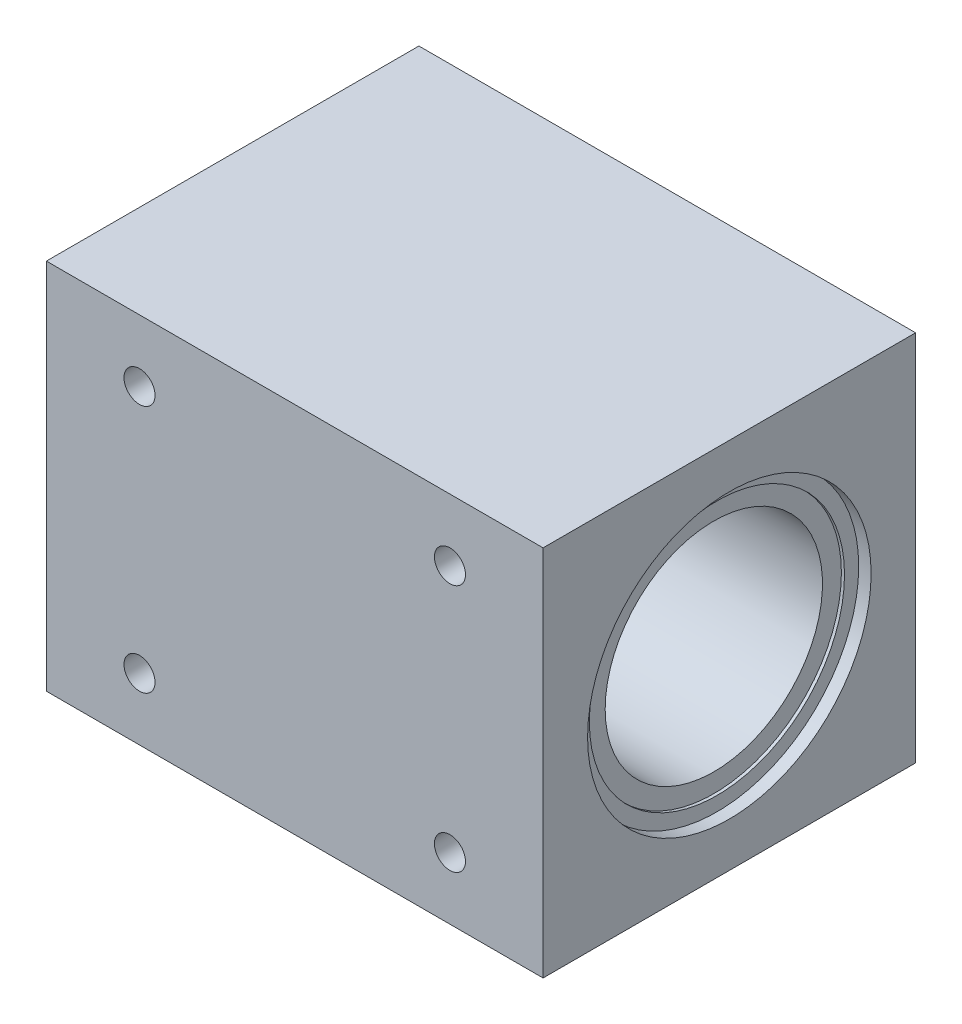
ISO-10303-21;
HEADER;
FILE_DESCRIPTION(('STEP AP214'),'2;1');
FILE_NAME('part.step','',(''),(''),'','','');
FILE_SCHEMA(('AUTOMOTIVE_DESIGN { 1 0 10303 214 1 1 1 1 }'));
ENDSEC;
DATA;
#1=APPLICATION_CONTEXT('core data for automotive mechanical design processes');
#2=APPLICATION_PROTOCOL_DEFINITION('international standard','automotive_design',2000,#1);
#3=PRODUCT_CONTEXT('',#1,'mechanical');
#4=PRODUCT('Part','Part','',(#3));
#5=PRODUCT_RELATED_PRODUCT_CATEGORY('part','',(#4));
#6=PRODUCT_DEFINITION_FORMATION('','',#4);
#7=PRODUCT_DEFINITION_CONTEXT('part definition',#1,'design');
#8=PRODUCT_DEFINITION('design','',#6,#7);
#9=PRODUCT_DEFINITION_SHAPE('','',#8);
#10=(LENGTH_UNIT() NAMED_UNIT(*) SI_UNIT(.MILLI.,.METRE.));
#11=(NAMED_UNIT(*) PLANE_ANGLE_UNIT() SI_UNIT($,.RADIAN.));
#12=(NAMED_UNIT(*) SI_UNIT($,.STERADIAN.) SOLID_ANGLE_UNIT());
#13=UNCERTAINTY_MEASURE_WITH_UNIT(LENGTH_MEASURE(1.E-05),#10,'distance_accuracy_value','');
#14=(GEOMETRIC_REPRESENTATION_CONTEXT(3) GLOBAL_UNCERTAINTY_ASSIGNED_CONTEXT((#13)) GLOBAL_UNIT_ASSIGNED_CONTEXT((#10,
#11,#12)) REPRESENTATION_CONTEXT('',''));
#15=CARTESIAN_POINT('',(0.,0.,0.));
#16=DIRECTION('',(0.,0.,1.));
#17=DIRECTION('',(1.,0.,0.));
#18=AXIS2_PLACEMENT_3D('',#15,#16,#17);
#19=CARTESIAN_POINT('',(80.,0.,0.));
#20=DIRECTION('',(-1.,0.,0.));
#21=DIRECTION('',(0.,0.,1.));
#22=AXIS2_PLACEMENT_3D('',#19,#20,#21);
#23=CYLINDRICAL_SURFACE('',#22,17.5);
#24=CARTESIAN_POINT('',(2.5,0.,0.));
#25=DIRECTION('',(-1.,0.,0.));
#26=DIRECTION('',(0.,0.,1.));
#27=AXIS2_PLACEMENT_3D('',#24,#25,#26);
#28=CIRCLE('',#27,17.5);
#29=CARTESIAN_POINT('',(2.5,0.,17.5));
#30=VERTEX_POINT('',#29);
#31=EDGE_CURVE('E161',#30,#30,#28,.T.);
#32=ORIENTED_EDGE('',*,*,#31,.T.);
#33=EDGE_LOOP('',(#32));
#34=FACE_BOUND('',#33,.T.);
#35=CARTESIAN_POINT('',(77.5,0.,0.));
#36=DIRECTION('',(-1.,0.,0.));
#37=DIRECTION('',(0.,0.,1.));
#38=AXIS2_PLACEMENT_3D('',#35,#36,#37);
#39=CIRCLE('',#38,17.5);
#40=CARTESIAN_POINT('',(77.5,0.,17.5));
#41=VERTEX_POINT('',#40);
#42=EDGE_CURVE('E146',#41,#41,#39,.T.);
#43=ORIENTED_EDGE('',*,*,#42,.F.);
#44=EDGE_LOOP('',(#43));
#45=FACE_BOUND('',#44,.T.);
#46=ADVANCED_FACE('F40',(#34,#45),#23,.F.);
#47=CARTESIAN_POINT('',(80.,0.,0.));
#48=DIRECTION('',(1.,0.,0.));
#49=DIRECTION('',(0.,0.,-1.));
#50=AXIS2_PLACEMENT_3D('',#47,#48,#49);
#51=PLANE('',#50);
#52=DIRECTION('',(0.,-1.,0.));
#53=VECTOR('',#52,1.);
#54=CARTESIAN_POINT('',(80.,30.,30.));
#55=LINE('',#54,#53);
#56=CARTESIAN_POINT('',(80.,30.,30.));
#57=VERTEX_POINT('',#56);
#58=CARTESIAN_POINT('',(80.,-30.,30.));
#59=VERTEX_POINT('',#58);
#60=EDGE_CURVE('E165',#57,#59,#55,.T.);
#61=ORIENTED_EDGE('',*,*,#60,.T.);
#62=DIRECTION('',(0.,0.,-1.));
#63=VECTOR('',#62,1.);
#64=CARTESIAN_POINT('',(80.,-30.,30.));
#65=LINE('',#64,#63);
#66=CARTESIAN_POINT('',(80.,-30.,-30.));
#67=VERTEX_POINT('',#66);
#68=EDGE_CURVE('E88',#59,#67,#65,.T.);
#69=ORIENTED_EDGE('',*,*,#68,.T.);
#70=DIRECTION('',(0.,1.,0.));
#71=VECTOR('',#70,1.);
#72=CARTESIAN_POINT('',(80.,-30.,-30.));
#73=LINE('',#72,#71);
#74=CARTESIAN_POINT('',(80.,30.,-30.));
#75=VERTEX_POINT('',#74);
#76=EDGE_CURVE('E168',#67,#75,#73,.T.);
#77=ORIENTED_EDGE('',*,*,#76,.T.);
#78=DIRECTION('',(0.,0.,1.));
#79=VECTOR('',#78,1.);
#80=CARTESIAN_POINT('',(80.,30.,-30.));
#81=LINE('',#80,#79);
#82=EDGE_CURVE('E57',#75,#57,#81,.T.);
#83=ORIENTED_EDGE('',*,*,#82,.T.);
#84=EDGE_LOOP('',(#61,#69,#77,#83));
#85=FACE_BOUND('',#84,.T.);
#86=CARTESIAN_POINT('',(80.,0.,0.));
#87=DIRECTION('',(-1.,0.,0.));
#88=DIRECTION('',(0.,0.,1.));
#89=AXIS2_PLACEMENT_3D('',#86,#87,#88);
#90=CIRCLE('',#89,22.8333333333333);
#91=CARTESIAN_POINT('',(80.,0.,22.8333333333333));
#92=VERTEX_POINT('',#91);
#93=EDGE_CURVE('E143',#92,#92,#90,.T.);
#94=ORIENTED_EDGE('',*,*,#93,.T.);
#95=EDGE_LOOP('',(#94));
#96=FACE_BOUND('',#95,.T.);
#97=ADVANCED_FACE('F204',(#85,#96),#51,.T.);
#98=CARTESIAN_POINT('',(0.,0.,0.));
#99=DIRECTION('',(1.,0.,0.));
#100=DIRECTION('',(0.,0.,-1.));
#101=AXIS2_PLACEMENT_3D('',#98,#99,#100);
#102=PLANE('',#101);
#103=DIRECTION('',(0.,-1.,0.));
#104=VECTOR('',#103,1.);
#105=CARTESIAN_POINT('',(0.,30.,30.));
#106=LINE('',#105,#104);
#107=CARTESIAN_POINT('',(0.,30.,30.));
#108=VERTEX_POINT('',#107);
#109=CARTESIAN_POINT('',(0.,-30.,30.));
#110=VERTEX_POINT('',#109);
#111=EDGE_CURVE('E164',#108,#110,#106,.T.);
#112=ORIENTED_EDGE('',*,*,#111,.F.);
#113=DIRECTION('',(0.,0.,1.));
#114=VECTOR('',#113,1.);
#115=CARTESIAN_POINT('',(0.,30.,-30.));
#116=LINE('',#115,#114);
#117=CARTESIAN_POINT('',(0.,30.,-30.));
#118=VERTEX_POINT('',#117);
#119=EDGE_CURVE('E81',#118,#108,#116,.T.);
#120=ORIENTED_EDGE('',*,*,#119,.F.);
#121=DIRECTION('',(0.,1.,0.));
#122=VECTOR('',#121,1.);
#123=CARTESIAN_POINT('',(0.,-30.,-30.));
#124=LINE('',#123,#122);
#125=CARTESIAN_POINT('',(0.,-30.,-30.));
#126=VERTEX_POINT('',#125);
#127=EDGE_CURVE('E75',#126,#118,#124,.T.);
#128=ORIENTED_EDGE('',*,*,#127,.F.);
#129=DIRECTION('',(0.,0.,-1.));
#130=VECTOR('',#129,1.);
#131=CARTESIAN_POINT('',(0.,-30.,30.));
#132=LINE('',#131,#130);
#133=EDGE_CURVE('E174',#110,#126,#132,.T.);
#134=ORIENTED_EDGE('',*,*,#133,.F.);
#135=EDGE_LOOP('',(#112,#120,#128,#134));
#136=FACE_BOUND('',#135,.T.);
#137=CARTESIAN_POINT('',(0.,0.,0.));
#138=DIRECTION('',(-1.,0.,0.));
#139=DIRECTION('',(0.,0.,1.));
#140=AXIS2_PLACEMENT_3D('',#137,#138,#139);
#141=CIRCLE('',#140,22.8333333333333);
#142=CARTESIAN_POINT('',(0.,0.,22.8333333333333));
#143=VERTEX_POINT('',#142);
#144=EDGE_CURVE('E149',#143,#143,#141,.T.);
#145=ORIENTED_EDGE('',*,*,#144,.F.);
#146=EDGE_LOOP('',(#145));
#147=FACE_BOUND('',#146,.T.);
#148=ADVANCED_FACE('F184',(#136,#147),#102,.F.);
#149=CARTESIAN_POINT('',(80.,30.,30.));
#150=DIRECTION('',(0.,0.,-1.));
#151=DIRECTION('',(-1.,0.,0.));
#152=AXIS2_PLACEMENT_3D('',#149,#150,#151);
#153=PLANE('',#152);
#154=CARTESIAN_POINT('',(15.,20.,30.));
#155=DIRECTION('',(0.,0.,1.));
#156=DIRECTION('',(1.,0.,0.));
#157=AXIS2_PLACEMENT_3D('',#154,#155,#156);
#158=CIRCLE('',#157,2.49999999999999);
#159=CARTESIAN_POINT('',(17.5,20.,30.));
#160=VERTEX_POINT('',#159);
#161=EDGE_CURVE('E112',#160,#160,#158,.T.);
#162=ORIENTED_EDGE('',*,*,#161,.F.);
#163=EDGE_LOOP('',(#162));
#164=FACE_BOUND('',#163,.T.);
#165=CARTESIAN_POINT('',(15.,-20.,30.));
#166=DIRECTION('',(0.,0.,1.));
#167=DIRECTION('',(1.,0.,0.));
#168=AXIS2_PLACEMENT_3D('',#165,#166,#167);
#169=CIRCLE('',#168,2.49999999999999);
#170=CARTESIAN_POINT('',(17.5,-20.,30.));
#171=VERTEX_POINT('',#170);
#172=EDGE_CURVE('E111',#171,#171,#169,.T.);
#173=ORIENTED_EDGE('',*,*,#172,.F.);
#174=EDGE_LOOP('',(#173));
#175=FACE_BOUND('',#174,.T.);
#176=CARTESIAN_POINT('',(65.,-20.,30.));
#177=DIRECTION('',(0.,0.,1.));
#178=DIRECTION('',(1.,0.,0.));
#179=AXIS2_PLACEMENT_3D('',#176,#177,#178);
#180=CIRCLE('',#179,2.49999999999999);
#181=CARTESIAN_POINT('',(67.5,-20.,30.));
#182=VERTEX_POINT('',#181);
#183=EDGE_CURVE('E122',#182,#182,#180,.T.);
#184=ORIENTED_EDGE('',*,*,#183,.F.);
#185=EDGE_LOOP('',(#184));
#186=FACE_BOUND('',#185,.T.);
#187=CARTESIAN_POINT('',(65.,20.,30.));
#188=DIRECTION('',(0.,0.,1.));
#189=DIRECTION('',(1.,0.,0.));
#190=AXIS2_PLACEMENT_3D('',#187,#188,#189);
#191=CIRCLE('',#190,2.49999999999999);
#192=CARTESIAN_POINT('',(67.5,20.,30.));
#193=VERTEX_POINT('',#192);
#194=EDGE_CURVE('E128',#193,#193,#191,.T.);
#195=ORIENTED_EDGE('',*,*,#194,.F.);
#196=EDGE_LOOP('',(#195));
#197=FACE_BOUND('',#196,.T.);
#198=ORIENTED_EDGE('',*,*,#111,.T.);
#199=DIRECTION('',(-1.,0.,0.));
#200=VECTOR('',#199,1.);
#201=CARTESIAN_POINT('',(80.,-30.,30.));
#202=LINE('',#201,#200);
#203=EDGE_CURVE('E11',#59,#110,#202,.T.);
#204=ORIENTED_EDGE('',*,*,#203,.F.);
#205=ORIENTED_EDGE('',*,*,#60,.F.);
#206=DIRECTION('',(-1.,0.,0.));
#207=VECTOR('',#206,1.);
#208=CARTESIAN_POINT('',(80.,30.,30.));
#209=LINE('',#208,#207);
#210=EDGE_CURVE('E171',#57,#108,#209,.T.);
#211=ORIENTED_EDGE('',*,*,#210,.T.);
#212=EDGE_LOOP('',(#198,#204,#205,#211));
#213=FACE_BOUND('',#212,.T.);
#214=ADVANCED_FACE('F42',(#164,#175,#186,#197,#213),#153,.F.);
#215=CARTESIAN_POINT('',(80.,-30.,30.));
#216=DIRECTION('',(0.,1.,0.));
#217=DIRECTION('',(0.,0.,1.));
#218=AXIS2_PLACEMENT_3D('',#215,#216,#217);
#219=PLANE('',#218);
#220=ORIENTED_EDGE('',*,*,#133,.T.);
#221=DIRECTION('',(-1.,0.,0.));
#222=VECTOR('',#221,1.);
#223=CARTESIAN_POINT('',(80.,-30.,-30.));
#224=LINE('',#223,#222);
#225=EDGE_CURVE('E49',#67,#126,#224,.T.);
#226=ORIENTED_EDGE('',*,*,#225,.F.);
#227=ORIENTED_EDGE('',*,*,#68,.F.);
#228=ORIENTED_EDGE('',*,*,#203,.T.);
#229=EDGE_LOOP('',(#220,#226,#227,#228));
#230=FACE_BOUND('',#229,.T.);
#231=ADVANCED_FACE('F200',(#230),#219,.F.);
#232=CARTESIAN_POINT('',(80.,-30.,-30.));
#233=DIRECTION('',(0.,0.,1.));
#234=DIRECTION('',(1.,0.,0.));
#235=AXIS2_PLACEMENT_3D('',#232,#233,#234);
#236=PLANE('',#235);
#237=ORIENTED_EDGE('',*,*,#127,.T.);
#238=DIRECTION('',(-1.,0.,0.));
#239=VECTOR('',#238,1.);
#240=CARTESIAN_POINT('',(80.,30.,-30.));
#241=LINE('',#240,#239);
#242=EDGE_CURVE('E179',#75,#118,#241,.T.);
#243=ORIENTED_EDGE('',*,*,#242,.F.);
#244=ORIENTED_EDGE('',*,*,#76,.F.);
#245=ORIENTED_EDGE('',*,*,#225,.T.);
#246=EDGE_LOOP('',(#237,#243,#244,#245));
#247=FACE_BOUND('',#246,.T.);
#248=ADVANCED_FACE('F181',(#247),#236,.F.);
#249=CARTESIAN_POINT('',(80.,30.,-30.));
#250=DIRECTION('',(0.,-1.,0.));
#251=DIRECTION('',(0.,0.,-1.));
#252=AXIS2_PLACEMENT_3D('',#249,#250,#251);
#253=PLANE('',#252);
#254=ORIENTED_EDGE('',*,*,#119,.T.);
#255=ORIENTED_EDGE('',*,*,#210,.F.);
#256=ORIENTED_EDGE('',*,*,#82,.F.);
#257=ORIENTED_EDGE('',*,*,#242,.T.);
#258=EDGE_LOOP('',(#254,#255,#256,#257));
#259=FACE_BOUND('',#258,.T.);
#260=ADVANCED_FACE('F189',(#259),#253,.F.);
#261=CARTESIAN_POINT('',(2.5,17.5,0.));
#262=DIRECTION('',(-1.,0.,0.));
#263=DIRECTION('',(0.,0.,1.));
#264=AXIS2_PLACEMENT_3D('',#261,#262,#263);
#265=PLANE('',#264);
#266=CARTESIAN_POINT('',(2.5,0.,0.));
#267=DIRECTION('',(-1.,0.,0.));
#268=DIRECTION('',(0.,0.,1.));
#269=AXIS2_PLACEMENT_3D('',#266,#267,#268);
#270=CIRCLE('',#269,20.547619047619);
#271=CARTESIAN_POINT('',(2.5,0.,20.547619047619));
#272=VERTEX_POINT('',#271);
#273=EDGE_CURVE('E158',#272,#272,#270,.T.);
#274=ORIENTED_EDGE('',*,*,#273,.T.);
#275=EDGE_LOOP('',(#274));
#276=FACE_BOUND('',#275,.T.);
#277=ORIENTED_EDGE('',*,*,#31,.F.);
#278=EDGE_LOOP('',(#277));
#279=FACE_BOUND('',#278,.T.);
#280=ADVANCED_FACE('F191',(#276,#279),#265,.T.);
#281=CARTESIAN_POINT('',(80.,0.,0.));
#282=DIRECTION('',(-1.,0.,0.));
#283=DIRECTION('',(0.,0.,1.));
#284=AXIS2_PLACEMENT_3D('',#281,#282,#283);
#285=CYLINDRICAL_SURFACE('',#284,20.547619047619);
#286=CARTESIAN_POINT('',(2.,0.,0.));
#287=DIRECTION('',(-1.,0.,0.));
#288=DIRECTION('',(0.,0.,1.));
#289=AXIS2_PLACEMENT_3D('',#286,#287,#288);
#290=CIRCLE('',#289,20.547619047619);
#291=CARTESIAN_POINT('',(2.,0.,20.547619047619));
#292=VERTEX_POINT('',#291);
#293=EDGE_CURVE('E155',#292,#292,#290,.T.);
#294=ORIENTED_EDGE('',*,*,#293,.T.);
#295=EDGE_LOOP('',(#294));
#296=FACE_BOUND('',#295,.T.);
#297=ORIENTED_EDGE('',*,*,#273,.F.);
#298=EDGE_LOOP('',(#297));
#299=FACE_BOUND('',#298,.T.);
#300=ADVANCED_FACE('F197',(#296,#299),#285,.F.);
#301=CARTESIAN_POINT('',(2.,20.547619047619,0.));
#302=DIRECTION('',(-1.,0.,0.));
#303=DIRECTION('',(0.,0.,1.));
#304=AXIS2_PLACEMENT_3D('',#301,#302,#303);
#305=PLANE('',#304);
#306=CARTESIAN_POINT('',(2.,0.,0.));
#307=DIRECTION('',(-1.,0.,0.));
#308=DIRECTION('',(0.,0.,1.));
#309=AXIS2_PLACEMENT_3D('',#306,#307,#308);
#310=CIRCLE('',#309,22.8333333333333);
#311=CARTESIAN_POINT('',(2.,0.,22.8333333333333));
#312=VERTEX_POINT('',#311);
#313=EDGE_CURVE('E152',#312,#312,#310,.T.);
#314=ORIENTED_EDGE('',*,*,#313,.T.);
#315=EDGE_LOOP('',(#314));
#316=FACE_BOUND('',#315,.T.);
#317=ORIENTED_EDGE('',*,*,#293,.F.);
#318=EDGE_LOOP('',(#317));
#319=FACE_BOUND('',#318,.T.);
#320=ADVANCED_FACE('F266',(#316,#319),#305,.T.);
#321=CARTESIAN_POINT('',(80.,0.,0.));
#322=DIRECTION('',(-1.,0.,0.));
#323=DIRECTION('',(0.,0.,1.));
#324=AXIS2_PLACEMENT_3D('',#321,#322,#323);
#325=CYLINDRICAL_SURFACE('',#324,22.8333333333333);
#326=ORIENTED_EDGE('',*,*,#144,.T.);
#327=EDGE_LOOP('',(#326));
#328=FACE_BOUND('',#327,.T.);
#329=ORIENTED_EDGE('',*,*,#313,.F.);
#330=EDGE_LOOP('',(#329));
#331=FACE_BOUND('',#330,.T.);
#332=ADVANCED_FACE('F262',(#328,#331),#325,.F.);
#333=CARTESIAN_POINT('',(77.5,20.547619047619,0.));
#334=DIRECTION('',(1.,0.,0.));
#335=DIRECTION('',(0.,0.,-1.));
#336=AXIS2_PLACEMENT_3D('',#333,#334,#335);
#337=PLANE('',#336);
#338=ORIENTED_EDGE('',*,*,#42,.T.);
#339=EDGE_LOOP('',(#338));
#340=FACE_BOUND('',#339,.T.);
#341=CARTESIAN_POINT('',(77.5,0.,0.));
#342=DIRECTION('',(-1.,0.,0.));
#343=DIRECTION('',(0.,0.,1.));
#344=AXIS2_PLACEMENT_3D('',#341,#342,#343);
#345=CIRCLE('',#344,20.547619047619);
#346=CARTESIAN_POINT('',(77.5,0.,20.547619047619));
#347=VERTEX_POINT('',#346);
#348=EDGE_CURVE('E134',#347,#347,#345,.T.);
#349=ORIENTED_EDGE('',*,*,#348,.F.);
#350=EDGE_LOOP('',(#349));
#351=FACE_BOUND('',#350,.T.);
#352=ADVANCED_FACE('F258',(#340,#351),#337,.T.);
#353=CARTESIAN_POINT('',(80.,0.,0.));
#354=DIRECTION('',(-1.,0.,0.));
#355=DIRECTION('',(0.,0.,1.));
#356=AXIS2_PLACEMENT_3D('',#353,#354,#355);
#357=CYLINDRICAL_SURFACE('',#356,22.8333333333333);
#358=CARTESIAN_POINT('',(78.,0.,0.));
#359=DIRECTION('',(-1.,0.,0.));
#360=DIRECTION('',(0.,0.,1.));
#361=AXIS2_PLACEMENT_3D('',#358,#359,#360);
#362=CIRCLE('',#361,22.8333333333333);
#363=CARTESIAN_POINT('',(78.,0.,22.8333333333333));
#364=VERTEX_POINT('',#363);
#365=EDGE_CURVE('E140',#364,#364,#362,.T.);
#366=ORIENTED_EDGE('',*,*,#365,.T.);
#367=EDGE_LOOP('',(#366));
#368=FACE_BOUND('',#367,.T.);
#369=ORIENTED_EDGE('',*,*,#93,.F.);
#370=EDGE_LOOP('',(#369));
#371=FACE_BOUND('',#370,.T.);
#372=ADVANCED_FACE('F254',(#368,#371),#357,.F.);
#373=CARTESIAN_POINT('',(78.,22.8333333333333,0.));
#374=DIRECTION('',(1.,0.,0.));
#375=DIRECTION('',(0.,0.,-1.));
#376=AXIS2_PLACEMENT_3D('',#373,#374,#375);
#377=PLANE('',#376);
#378=CARTESIAN_POINT('',(78.,0.,0.));
#379=DIRECTION('',(-1.,0.,0.));
#380=DIRECTION('',(0.,0.,1.));
#381=AXIS2_PLACEMENT_3D('',#378,#379,#380);
#382=CIRCLE('',#381,20.547619047619);
#383=CARTESIAN_POINT('',(78.,0.,20.547619047619));
#384=VERTEX_POINT('',#383);
#385=EDGE_CURVE('E137',#384,#384,#382,.T.);
#386=ORIENTED_EDGE('',*,*,#385,.T.);
#387=EDGE_LOOP('',(#386));
#388=FACE_BOUND('',#387,.T.);
#389=ORIENTED_EDGE('',*,*,#365,.F.);
#390=EDGE_LOOP('',(#389));
#391=FACE_BOUND('',#390,.T.);
#392=ADVANCED_FACE('F250',(#388,#391),#377,.T.);
#393=CARTESIAN_POINT('',(80.,0.,0.));
#394=DIRECTION('',(-1.,0.,0.));
#395=DIRECTION('',(0.,0.,1.));
#396=AXIS2_PLACEMENT_3D('',#393,#394,#395);
#397=CYLINDRICAL_SURFACE('',#396,20.547619047619);
#398=ORIENTED_EDGE('',*,*,#348,.T.);
#399=EDGE_LOOP('',(#398));
#400=FACE_BOUND('',#399,.T.);
#401=ORIENTED_EDGE('',*,*,#385,.F.);
#402=EDGE_LOOP('',(#401));
#403=FACE_BOUND('',#402,.T.);
#404=ADVANCED_FACE('F242',(#400,#403),#397,.F.);
#405=CARTESIAN_POINT('',(65.,20.,13.));
#406=DIRECTION('',(0.,0.,1.));
#407=DIRECTION('',(1.,0.,0.));
#408=AXIS2_PLACEMENT_3D('',#405,#406,#407);
#409=CONICAL_SURFACE('',#408,2.49999999999999,1.02974425867665);
#410=CARTESIAN_POINT('',(65.,20.,11.4978484524311));
#411=VERTEX_POINT('',#410);
#412=VERTEX_LOOP('',#411);
#413=FACE_BOUND('',#412,.T.);
#414=CARTESIAN_POINT('',(65.,20.,13.));
#415=DIRECTION('',(0.,0.,1.));
#416=DIRECTION('',(1.,0.,0.));
#417=AXIS2_PLACEMENT_3D('',#414,#415,#416);
#418=CIRCLE('',#417,2.49999999999999);
#419=CARTESIAN_POINT('',(67.5,20.,13.));
#420=VERTEX_POINT('',#419);
#421=EDGE_CURVE('E131',#420,#420,#418,.T.);
#422=ORIENTED_EDGE('',*,*,#421,.T.);
#423=EDGE_LOOP('',(#422));
#424=FACE_BOUND('',#423,.T.);
#425=ADVANCED_FACE('F232',(#413,#424),#409,.F.);
#426=CARTESIAN_POINT('',(65.,20.,30.));
#427=DIRECTION('',(0.,0.,1.));
#428=DIRECTION('',(1.,0.,0.));
#429=AXIS2_PLACEMENT_3D('',#426,#427,#428);
#430=CYLINDRICAL_SURFACE('',#429,2.49999999999999);
#431=ORIENTED_EDGE('',*,*,#421,.F.);
#432=EDGE_LOOP('',(#431));
#433=FACE_BOUND('',#432,.T.);
#434=ORIENTED_EDGE('',*,*,#194,.T.);
#435=EDGE_LOOP('',(#434));
#436=FACE_BOUND('',#435,.T.);
#437=ADVANCED_FACE('F229',(#433,#436),#430,.F.);
#438=CARTESIAN_POINT('',(65.,-20.,13.));
#439=DIRECTION('',(0.,0.,1.));
#440=DIRECTION('',(1.,0.,0.));
#441=AXIS2_PLACEMENT_3D('',#438,#439,#440);
#442=CONICAL_SURFACE('',#441,2.49999999999999,1.02974425867665);
#443=CARTESIAN_POINT('',(65.,-20.,11.4978484524311));
#444=VERTEX_POINT('',#443);
#445=VERTEX_LOOP('',#444);
#446=FACE_BOUND('',#445,.T.);
#447=CARTESIAN_POINT('',(65.,-20.,13.));
#448=DIRECTION('',(0.,0.,1.));
#449=DIRECTION('',(1.,0.,0.));
#450=AXIS2_PLACEMENT_3D('',#447,#448,#449);
#451=CIRCLE('',#450,2.49999999999999);
#452=CARTESIAN_POINT('',(67.5,-20.,13.));
#453=VERTEX_POINT('',#452);
#454=EDGE_CURVE('E125',#453,#453,#451,.T.);
#455=ORIENTED_EDGE('',*,*,#454,.T.);
#456=EDGE_LOOP('',(#455));
#457=FACE_BOUND('',#456,.T.);
#458=ADVANCED_FACE('F231',(#446,#457),#442,.F.);
#459=CARTESIAN_POINT('',(65.,-20.,30.));
#460=DIRECTION('',(0.,0.,1.));
#461=DIRECTION('',(1.,0.,0.));
#462=AXIS2_PLACEMENT_3D('',#459,#460,#461);
#463=CYLINDRICAL_SURFACE('',#462,2.49999999999999);
#464=ORIENTED_EDGE('',*,*,#454,.F.);
#465=EDGE_LOOP('',(#464));
#466=FACE_BOUND('',#465,.T.);
#467=ORIENTED_EDGE('',*,*,#183,.T.);
#468=EDGE_LOOP('',(#467));
#469=FACE_BOUND('',#468,.T.);
#470=ADVANCED_FACE('F239',(#466,#469),#463,.F.);
#471=CARTESIAN_POINT('',(15.,-20.,13.));
#472=DIRECTION('',(0.,0.,1.));
#473=DIRECTION('',(1.,0.,0.));
#474=AXIS2_PLACEMENT_3D('',#471,#472,#473);
#475=CONICAL_SURFACE('',#474,2.49999999999998,1.02974425867665);
#476=CARTESIAN_POINT('',(15.,-20.,11.4978484524311));
#477=VERTEX_POINT('',#476);
#478=VERTEX_LOOP('',#477);
#479=FACE_BOUND('',#478,.T.);
#480=CARTESIAN_POINT('',(15.,-20.,13.));
#481=DIRECTION('',(0.,0.,1.));
#482=DIRECTION('',(1.,0.,0.));
#483=AXIS2_PLACEMENT_3D('',#480,#481,#482);
#484=CIRCLE('',#483,2.49999999999998);
#485=CARTESIAN_POINT('',(17.5,-20.,13.));
#486=VERTEX_POINT('',#485);
#487=EDGE_CURVE('E115',#486,#486,#484,.T.);
#488=ORIENTED_EDGE('',*,*,#487,.T.);
#489=EDGE_LOOP('',(#488));
#490=FACE_BOUND('',#489,.T.);
#491=ADVANCED_FACE('F339',(#479,#490),#475,.F.);
#492=CARTESIAN_POINT('',(15.,-20.,30.));
#493=DIRECTION('',(0.,0.,1.));
#494=DIRECTION('',(1.,0.,0.));
#495=AXIS2_PLACEMENT_3D('',#492,#493,#494);
#496=CYLINDRICAL_SURFACE('',#495,2.49999999999999);
#497=ORIENTED_EDGE('',*,*,#487,.F.);
#498=EDGE_LOOP('',(#497));
#499=FACE_BOUND('',#498,.T.);
#500=ORIENTED_EDGE('',*,*,#172,.T.);
#501=EDGE_LOOP('',(#500));
#502=FACE_BOUND('',#501,.T.);
#503=ADVANCED_FACE('F105',(#499,#502),#496,.F.);
#504=CARTESIAN_POINT('',(15.,20.,13.));
#505=DIRECTION('',(0.,0.,1.));
#506=DIRECTION('',(1.,0.,0.));
#507=AXIS2_PLACEMENT_3D('',#504,#505,#506);
#508=CONICAL_SURFACE('',#507,2.49999999999998,1.02974425867665);
#509=CARTESIAN_POINT('',(15.,20.,11.4978484524311));
#510=VERTEX_POINT('',#509);
#511=VERTEX_LOOP('',#510);
#512=FACE_BOUND('',#511,.T.);
#513=CARTESIAN_POINT('',(15.,20.,13.));
#514=DIRECTION('',(0.,0.,1.));
#515=DIRECTION('',(1.,0.,0.));
#516=AXIS2_PLACEMENT_3D('',#513,#514,#515);
#517=CIRCLE('',#516,2.49999999999998);
#518=CARTESIAN_POINT('',(17.5,20.,13.));
#519=VERTEX_POINT('',#518);
#520=EDGE_CURVE('E109',#519,#519,#517,.T.);
#521=ORIENTED_EDGE('',*,*,#520,.T.);
#522=EDGE_LOOP('',(#521));
#523=FACE_BOUND('',#522,.T.);
#524=ADVANCED_FACE('F101',(#512,#523),#508,.F.);
#525=CARTESIAN_POINT('',(15.,20.,30.));
#526=DIRECTION('',(0.,0.,1.));
#527=DIRECTION('',(1.,0.,0.));
#528=AXIS2_PLACEMENT_3D('',#525,#526,#527);
#529=CYLINDRICAL_SURFACE('',#528,2.49999999999999);
#530=ORIENTED_EDGE('',*,*,#520,.F.);
#531=EDGE_LOOP('',(#530));
#532=FACE_BOUND('',#531,.T.);
#533=ORIENTED_EDGE('',*,*,#161,.T.);
#534=EDGE_LOOP('',(#533));
#535=FACE_BOUND('',#534,.T.);
#536=ADVANCED_FACE('F104',(#532,#535),#529,.F.);
#537=CLOSED_SHELL('',(#46,#97,#148,#214,#231,#248,#260,#280,#300,#320,#332,#352,#372,#392,#404,
#425,#437,#458,#470,#491,#503,#524,#536));
#538=MANIFOLD_SOLID_BREP('B2',#537);
#539=ADVANCED_BREP_SHAPE_REPRESENTATION('',(#18,#538),#14);
#540=SHAPE_DEFINITION_REPRESENTATION(#9,#539);
ENDSEC;
END-ISO-10303-21;
